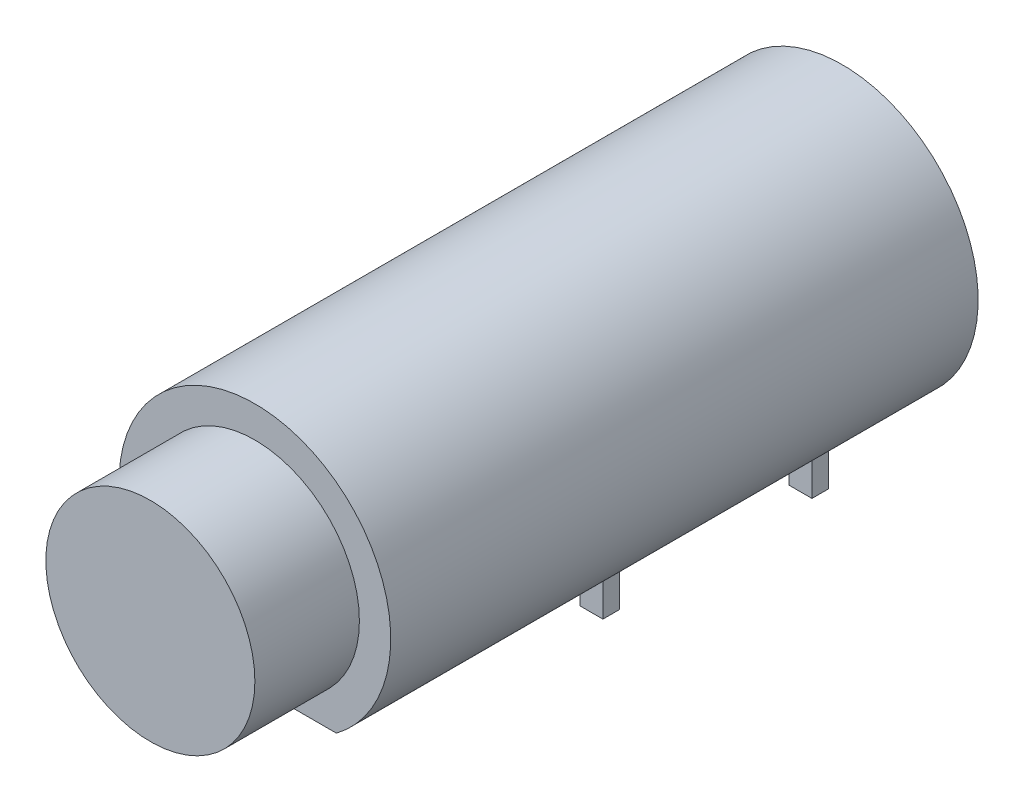
ISO-10303-21;
HEADER;
FILE_DESCRIPTION(('STEP AP214'),'2;1');
FILE_NAME('part.step','',(''),(''),'','','');
FILE_SCHEMA(('AUTOMOTIVE_DESIGN { 1 0 10303 214 1 1 1 1 }'));
ENDSEC;
DATA;
#1=APPLICATION_CONTEXT('core data for automotive mechanical design processes');
#2=APPLICATION_PROTOCOL_DEFINITION('international standard','automotive_design',2000,#1);
#3=PRODUCT_CONTEXT('',#1,'mechanical');
#4=PRODUCT('Part','Part','',(#3));
#5=PRODUCT_RELATED_PRODUCT_CATEGORY('part','',(#4));
#6=PRODUCT_DEFINITION_FORMATION('','',#4);
#7=PRODUCT_DEFINITION_CONTEXT('part definition',#1,'design');
#8=PRODUCT_DEFINITION('design','',#6,#7);
#9=PRODUCT_DEFINITION_SHAPE('','',#8);
#10=(LENGTH_UNIT() NAMED_UNIT(*) SI_UNIT(.MILLI.,.METRE.));
#11=(NAMED_UNIT(*) PLANE_ANGLE_UNIT() SI_UNIT($,.RADIAN.));
#12=(NAMED_UNIT(*) SI_UNIT($,.STERADIAN.) SOLID_ANGLE_UNIT());
#13=UNCERTAINTY_MEASURE_WITH_UNIT(LENGTH_MEASURE(1.E-05),#10,'distance_accuracy_value','');
#14=(GEOMETRIC_REPRESENTATION_CONTEXT(3) GLOBAL_UNCERTAINTY_ASSIGNED_CONTEXT((#13)) GLOBAL_UNIT_ASSIGNED_CONTEXT((#10,
#11,#12)) REPRESENTATION_CONTEXT('',''));
#15=CARTESIAN_POINT('',(0.,0.,0.));
#16=DIRECTION('',(0.,0.,1.));
#17=DIRECTION('',(1.,0.,0.));
#18=AXIS2_PLACEMENT_3D('',#15,#16,#17);
#19=CARTESIAN_POINT('',(-3.9,-5.2,33.1));
#20=DIRECTION('',(0.,1.,0.));
#21=DIRECTION('',(0.,0.,1.));
#22=AXIS2_PLACEMENT_3D('',#19,#20,#21);
#23=PLANE('',#22);
#24=DIRECTION('',(0.,0.,-1.));
#25=VECTOR('',#24,1.);
#26=CARTESIAN_POINT('',(-0.550000000000004,-5.2,12.));
#27=LINE('',#26,#25);
#28=CARTESIAN_POINT('',(-0.550000000000004,-5.2,12.));
#29=VERTEX_POINT('',#28);
#30=CARTESIAN_POINT('',(-0.55,-5.2,11.2));
#31=VERTEX_POINT('',#30);
#32=EDGE_CURVE('E129',#29,#31,#27,.T.);
#33=ORIENTED_EDGE('',*,*,#32,.F.);
#34=DIRECTION('',(-1.,0.,0.));
#35=VECTOR('',#34,1.);
#36=CARTESIAN_POINT('',(-0.550000000000004,-5.2,12.));
#37=LINE('',#36,#35);
#38=CARTESIAN_POINT('',(0.550000000000004,-5.2,12.));
#39=VERTEX_POINT('',#38);
#40=EDGE_CURVE('E142',#39,#29,#37,.T.);
#41=ORIENTED_EDGE('',*,*,#40,.F.);
#42=DIRECTION('',(0.,0.,1.));
#43=VECTOR('',#42,1.);
#44=CARTESIAN_POINT('',(0.550000000000004,-5.2,12.));
#45=LINE('',#44,#43);
#46=CARTESIAN_POINT('',(0.550000000000003,-5.2,11.2));
#47=VERTEX_POINT('',#46);
#48=EDGE_CURVE('E151',#47,#39,#45,.T.);
#49=ORIENTED_EDGE('',*,*,#48,.F.);
#50=DIRECTION('',(1.,0.,0.));
#51=VECTOR('',#50,1.);
#52=CARTESIAN_POINT('',(-0.55,-5.2,11.2));
#53=LINE('',#52,#51);
#54=EDGE_CURVE('E132',#31,#47,#53,.T.);
#55=ORIENTED_EDGE('',*,*,#54,.F.);
#56=EDGE_LOOP('',(#33,#41,#49,#55));
#57=FACE_BOUND('',#56,.T.);
#58=DIRECTION('',(1.,0.,0.));
#59=VECTOR('',#58,1.);
#60=CARTESIAN_POINT('',(-3.9,-5.2,28.1));
#61=LINE('',#60,#59);
#62=CARTESIAN_POINT('',(-3.9,-5.2,28.1));
#63=VERTEX_POINT('',#62);
#64=CARTESIAN_POINT('',(3.9,-5.2,28.1));
#65=VERTEX_POINT('',#64);
#66=EDGE_CURVE('E175',#63,#65,#61,.T.);
#67=ORIENTED_EDGE('',*,*,#66,.F.);
#68=DIRECTION('',(0.,0.,-1.));
#69=VECTOR('',#68,1.);
#70=CARTESIAN_POINT('',(-3.9,-5.2,33.1));
#71=LINE('',#70,#69);
#72=CARTESIAN_POINT('',(-3.9,-5.2,0.));
#73=VERTEX_POINT('',#72);
#74=EDGE_CURVE('E11',#63,#73,#71,.T.);
#75=ORIENTED_EDGE('',*,*,#74,.T.);
#76=DIRECTION('',(1.,0.,0.));
#77=VECTOR('',#76,1.);
#78=CARTESIAN_POINT('',(-3.9,-5.2,0.));
#79=LINE('',#78,#77);
#80=CARTESIAN_POINT('',(3.9,-5.2,0.));
#81=VERTEX_POINT('',#80);
#82=EDGE_CURVE('E180',#73,#81,#79,.T.);
#83=ORIENTED_EDGE('',*,*,#82,.T.);
#84=DIRECTION('',(0.,0.,-1.));
#85=VECTOR('',#84,1.);
#86=CARTESIAN_POINT('',(3.9,-5.2,33.1));
#87=LINE('',#86,#85);
#88=EDGE_CURVE('E40',#65,#81,#87,.T.);
#89=ORIENTED_EDGE('',*,*,#88,.F.);
#90=EDGE_LOOP('',(#67,#75,#83,#89));
#91=FACE_BOUND('',#90,.T.);
#92=DIRECTION('',(0.,0.,-1.));
#93=VECTOR('',#92,1.);
#94=CARTESIAN_POINT('',(-0.549999999999899,-5.2,2.));
#95=LINE('',#94,#93);
#96=CARTESIAN_POINT('',(-0.549999999999899,-5.2,2.));
#97=VERTEX_POINT('',#96);
#98=CARTESIAN_POINT('',(-0.549999999999895,-5.2,1.20000000000001));
#99=VERTEX_POINT('',#98);
#100=EDGE_CURVE('E128',#97,#99,#95,.T.);
#101=ORIENTED_EDGE('',*,*,#100,.F.);
#102=DIRECTION('',(-1.,0.,0.));
#103=VECTOR('',#102,1.);
#104=CARTESIAN_POINT('',(-0.549999999999899,-5.2,2.));
#105=LINE('',#104,#103);
#106=CARTESIAN_POINT('',(0.550000000000109,-5.2,2.));
#107=VERTEX_POINT('',#106);
#108=EDGE_CURVE('E125',#107,#97,#105,.T.);
#109=ORIENTED_EDGE('',*,*,#108,.F.);
#110=DIRECTION('',(0.,0.,1.));
#111=VECTOR('',#110,1.);
#112=CARTESIAN_POINT('',(0.550000000000108,-5.2,2.));
#113=LINE('',#112,#111);
#114=CARTESIAN_POINT('',(0.550000000000108,-5.2,1.20000000000001));
#115=VERTEX_POINT('',#114);
#116=EDGE_CURVE('E52',#115,#107,#113,.T.);
#117=ORIENTED_EDGE('',*,*,#116,.F.);
#118=DIRECTION('',(1.,0.,0.));
#119=VECTOR('',#118,1.);
#120=CARTESIAN_POINT('',(-0.549999999999895,-5.2,1.2));
#121=LINE('',#120,#119);
#122=EDGE_CURVE('E47',#99,#115,#121,.T.);
#123=ORIENTED_EDGE('',*,*,#122,.F.);
#124=EDGE_LOOP('',(#101,#109,#117,#123));
#125=FACE_BOUND('',#124,.T.);
#126=ADVANCED_FACE('F32',(#57,#91,#125),#23,.F.);
#127=CARTESIAN_POINT('',(0.,0.,33.1));
#128=DIRECTION('',(0.,0.,-1.));
#129=DIRECTION('',(-1.,0.,0.));
#130=AXIS2_PLACEMENT_3D('',#127,#128,#129);
#131=CYLINDRICAL_SURFACE('',#130,6.5);
#132=CARTESIAN_POINT('',(0.,0.,28.1));
#133=DIRECTION('',(0.,0.,1.));
#134=DIRECTION('',(1.,0.,0.));
#135=AXIS2_PLACEMENT_3D('',#132,#133,#134);
#136=CIRCLE('',#135,6.5);
#137=EDGE_CURVE('E171',#65,#63,#136,.T.);
#138=ORIENTED_EDGE('',*,*,#137,.F.);
#139=ORIENTED_EDGE('',*,*,#88,.T.);
#140=CARTESIAN_POINT('',(0.,0.,0.));
#141=DIRECTION('',(0.,0.,1.));
#142=DIRECTION('',(1.,0.,0.));
#143=AXIS2_PLACEMENT_3D('',#140,#141,#142);
#144=CIRCLE('',#143,6.5);
#145=EDGE_CURVE('E177',#81,#73,#144,.T.);
#146=ORIENTED_EDGE('',*,*,#145,.T.);
#147=ORIENTED_EDGE('',*,*,#74,.F.);
#148=EDGE_LOOP('',(#138,#139,#146,#147));
#149=FACE_BOUND('',#148,.T.);
#150=ADVANCED_FACE('F34',(#149),#131,.T.);
#151=CARTESIAN_POINT('',(0.,0.,0.));
#152=DIRECTION('',(0.,0.,1.));
#153=DIRECTION('',(1.,0.,0.));
#154=AXIS2_PLACEMENT_3D('',#151,#152,#153);
#155=PLANE('',#154);
#156=ORIENTED_EDGE('',*,*,#145,.F.);
#157=ORIENTED_EDGE('',*,*,#82,.F.);
#158=EDGE_LOOP('',(#156,#157));
#159=FACE_BOUND('',#158,.T.);
#160=ADVANCED_FACE('F191',(#159),#155,.F.);
#161=CARTESIAN_POINT('',(0.,0.,28.1));
#162=DIRECTION('',(0.,0.,1.));
#163=DIRECTION('',(1.,0.,0.));
#164=AXIS2_PLACEMENT_3D('',#161,#162,#163);
#165=PLANE('',#164);
#166=CARTESIAN_POINT('',(0.,0.,28.1));
#167=DIRECTION('',(0.,0.,1.));
#168=DIRECTION('',(1.,0.,0.));
#169=AXIS2_PLACEMENT_3D('',#166,#167,#168);
#170=CIRCLE('',#169,5.);
#171=CARTESIAN_POINT('',(5.,0.,28.1));
#172=VERTEX_POINT('',#171);
#173=EDGE_CURVE('E168',#172,#172,#170,.T.);
#174=ORIENTED_EDGE('',*,*,#173,.F.);
#175=EDGE_LOOP('',(#174));
#176=FACE_BOUND('',#175,.T.);
#177=ORIENTED_EDGE('',*,*,#137,.T.);
#178=ORIENTED_EDGE('',*,*,#66,.T.);
#179=EDGE_LOOP('',(#177,#178));
#180=FACE_BOUND('',#179,.T.);
#181=ADVANCED_FACE('F193',(#176,#180),#165,.T.);
#182=CARTESIAN_POINT('',(0.,0.,28.1));
#183=DIRECTION('',(0.,0.,1.));
#184=DIRECTION('',(1.,0.,0.));
#185=AXIS2_PLACEMENT_3D('',#182,#183,#184);
#186=CYLINDRICAL_SURFACE('',#185,5.);
#187=ORIENTED_EDGE('',*,*,#173,.T.);
#188=EDGE_LOOP('',(#187));
#189=FACE_BOUND('',#188,.T.);
#190=CARTESIAN_POINT('',(0.,0.,33.1));
#191=DIRECTION('',(0.,0.,1.));
#192=DIRECTION('',(1.,0.,0.));
#193=AXIS2_PLACEMENT_3D('',#190,#191,#192);
#194=CIRCLE('',#193,5.);
#195=CARTESIAN_POINT('',(5.,0.,33.1));
#196=VERTEX_POINT('',#195);
#197=EDGE_CURVE('E167',#196,#196,#194,.T.);
#198=ORIENTED_EDGE('',*,*,#197,.F.);
#199=EDGE_LOOP('',(#198));
#200=FACE_BOUND('',#199,.T.);
#201=ADVANCED_FACE('F199',(#189,#200),#186,.T.);
#202=CARTESIAN_POINT('',(0.,0.,33.1));
#203=DIRECTION('',(0.,0.,1.));
#204=DIRECTION('',(1.,0.,0.));
#205=AXIS2_PLACEMENT_3D('',#202,#203,#204);
#206=PLANE('',#205);
#207=ORIENTED_EDGE('',*,*,#197,.T.);
#208=EDGE_LOOP('',(#207));
#209=FACE_BOUND('',#208,.T.);
#210=ADVANCED_FACE('F231',(#209),#206,.T.);
#211=CARTESIAN_POINT('',(-0.550000000000004,-10.2,12.));
#212=DIRECTION('',(1.,0.,0.));
#213=DIRECTION('',(0.,0.,-1.));
#214=AXIS2_PLACEMENT_3D('',#211,#212,#213);
#215=PLANE('',#214);
#216=ORIENTED_EDGE('',*,*,#32,.T.);
#217=DIRECTION('',(0.,1.,0.));
#218=VECTOR('',#217,1.);
#219=CARTESIAN_POINT('',(-0.55,-10.2,11.2));
#220=LINE('',#219,#218);
#221=CARTESIAN_POINT('',(-0.55,-10.2,11.2));
#222=VERTEX_POINT('',#221);
#223=EDGE_CURVE('E164',#222,#31,#220,.T.);
#224=ORIENTED_EDGE('',*,*,#223,.F.);
#225=DIRECTION('',(0.,0.,-1.));
#226=VECTOR('',#225,1.);
#227=CARTESIAN_POINT('',(-0.550000000000004,-10.2,12.));
#228=LINE('',#227,#226);
#229=CARTESIAN_POINT('',(-0.550000000000004,-10.2,12.));
#230=VERTEX_POINT('',#229);
#231=EDGE_CURVE('E138',#230,#222,#228,.T.);
#232=ORIENTED_EDGE('',*,*,#231,.F.);
#233=DIRECTION('',(0.,1.,0.));
#234=VECTOR('',#233,1.);
#235=CARTESIAN_POINT('',(-0.550000000000004,-10.2,12.));
#236=LINE('',#235,#234);
#237=EDGE_CURVE('E147',#230,#29,#236,.T.);
#238=ORIENTED_EDGE('',*,*,#237,.T.);
#239=EDGE_LOOP('',(#216,#224,#232,#238));
#240=FACE_BOUND('',#239,.T.);
#241=ADVANCED_FACE('F215',(#240),#215,.F.);
#242=CARTESIAN_POINT('',(-0.55,-10.2,11.2));
#243=DIRECTION('',(0.,0.,1.));
#244=DIRECTION('',(1.,0.,0.));
#245=AXIS2_PLACEMENT_3D('',#242,#243,#244);
#246=PLANE('',#245);
#247=ORIENTED_EDGE('',*,*,#54,.T.);
#248=DIRECTION('',(0.,1.,0.));
#249=VECTOR('',#248,1.);
#250=CARTESIAN_POINT('',(0.550000000000004,-10.2,11.2));
#251=LINE('',#250,#249);
#252=CARTESIAN_POINT('',(0.550000000000004,-10.2,11.2));
#253=VERTEX_POINT('',#252);
#254=EDGE_CURVE('E161',#253,#47,#251,.T.);
#255=ORIENTED_EDGE('',*,*,#254,.F.);
#256=DIRECTION('',(1.,0.,0.));
#257=VECTOR('',#256,1.);
#258=CARTESIAN_POINT('',(-0.55,-10.2,11.2));
#259=LINE('',#258,#257);
#260=EDGE_CURVE('E141',#222,#253,#259,.T.);
#261=ORIENTED_EDGE('',*,*,#260,.F.);
#262=ORIENTED_EDGE('',*,*,#223,.T.);
#263=EDGE_LOOP('',(#247,#255,#261,#262));
#264=FACE_BOUND('',#263,.T.);
#265=ADVANCED_FACE('F223',(#264),#246,.F.);
#266=CARTESIAN_POINT('',(0.550000000000004,-10.2,12.));
#267=DIRECTION('',(-1.,0.,0.));
#268=DIRECTION('',(0.,0.,1.));
#269=AXIS2_PLACEMENT_3D('',#266,#267,#268);
#270=PLANE('',#269);
#271=ORIENTED_EDGE('',*,*,#48,.T.);
#272=DIRECTION('',(0.,1.,0.));
#273=VECTOR('',#272,1.);
#274=CARTESIAN_POINT('',(0.550000000000004,-10.2,12.));
#275=LINE('',#274,#273);
#276=CARTESIAN_POINT('',(0.550000000000004,-10.2,12.));
#277=VERTEX_POINT('',#276);
#278=EDGE_CURVE('E158',#277,#39,#275,.T.);
#279=ORIENTED_EDGE('',*,*,#278,.F.);
#280=DIRECTION('',(0.,0.,1.));
#281=VECTOR('',#280,1.);
#282=CARTESIAN_POINT('',(0.550000000000004,-10.2,12.));
#283=LINE('',#282,#281);
#284=EDGE_CURVE('E144',#253,#277,#283,.T.);
#285=ORIENTED_EDGE('',*,*,#284,.F.);
#286=ORIENTED_EDGE('',*,*,#254,.T.);
#287=EDGE_LOOP('',(#271,#279,#285,#286));
#288=FACE_BOUND('',#287,.T.);
#289=ADVANCED_FACE('F221',(#288),#270,.F.);
#290=CARTESIAN_POINT('',(-0.550000000000004,-10.2,12.));
#291=DIRECTION('',(0.,0.,-1.));
#292=DIRECTION('',(-1.,0.,0.));
#293=AXIS2_PLACEMENT_3D('',#290,#291,#292);
#294=PLANE('',#293);
#295=ORIENTED_EDGE('',*,*,#40,.T.);
#296=ORIENTED_EDGE('',*,*,#237,.F.);
#297=DIRECTION('',(-1.,0.,0.));
#298=VECTOR('',#297,1.);
#299=CARTESIAN_POINT('',(-0.550000000000004,-10.2,12.));
#300=LINE('',#299,#298);
#301=EDGE_CURVE('E146',#277,#230,#300,.T.);
#302=ORIENTED_EDGE('',*,*,#301,.F.);
#303=ORIENTED_EDGE('',*,*,#278,.T.);
#304=EDGE_LOOP('',(#295,#296,#302,#303));
#305=FACE_BOUND('',#304,.T.);
#306=ADVANCED_FACE('F211',(#305),#294,.F.);
#307=CARTESIAN_POINT('',(0.,-10.2,0.));
#308=DIRECTION('',(0.,-1.,0.));
#309=DIRECTION('',(0.,0.,-1.));
#310=AXIS2_PLACEMENT_3D('',#307,#308,#309);
#311=PLANE('',#310);
#312=ORIENTED_EDGE('',*,*,#231,.T.);
#313=ORIENTED_EDGE('',*,*,#260,.T.);
#314=ORIENTED_EDGE('',*,*,#284,.T.);
#315=ORIENTED_EDGE('',*,*,#301,.T.);
#316=EDGE_LOOP('',(#312,#313,#314,#315));
#317=FACE_BOUND('',#316,.T.);
#318=ADVANCED_FACE('F217',(#317),#311,.T.);
#319=CARTESIAN_POINT('',(-0.549999999999899,-10.2,2.));
#320=DIRECTION('',(1.,0.,0.));
#321=DIRECTION('',(0.,0.,-1.));
#322=AXIS2_PLACEMENT_3D('',#319,#320,#321);
#323=PLANE('',#322);
#324=ORIENTED_EDGE('',*,*,#100,.T.);
#325=DIRECTION('',(0.,1.,0.));
#326=VECTOR('',#325,1.);
#327=CARTESIAN_POINT('',(-0.549999999999895,-10.2,1.2));
#328=LINE('',#327,#326);
#329=CARTESIAN_POINT('',(-0.549999999999895,-10.2,1.2));
#330=VERTEX_POINT('',#329);
#331=EDGE_CURVE('E109',#330,#99,#328,.T.);
#332=ORIENTED_EDGE('',*,*,#331,.F.);
#333=DIRECTION('',(0.,0.,-1.));
#334=VECTOR('',#333,1.);
#335=CARTESIAN_POINT('',(-0.549999999999899,-10.2,2.));
#336=LINE('',#335,#334);
#337=CARTESIAN_POINT('',(-0.549999999999899,-10.2,2.));
#338=VERTEX_POINT('',#337);
#339=EDGE_CURVE('E116',#338,#330,#336,.T.);
#340=ORIENTED_EDGE('',*,*,#339,.F.);
#341=DIRECTION('',(0.,1.,0.));
#342=VECTOR('',#341,1.);
#343=CARTESIAN_POINT('',(-0.549999999999899,-10.2,2.));
#344=LINE('',#343,#342);
#345=EDGE_CURVE('E326',#338,#97,#344,.T.);
#346=ORIENTED_EDGE('',*,*,#345,.T.);
#347=EDGE_LOOP('',(#324,#332,#340,#346));
#348=FACE_BOUND('',#347,.T.);
#349=ADVANCED_FACE('F127',(#348),#323,.F.);
#350=CARTESIAN_POINT('',(-0.549999999999895,-10.2,1.2));
#351=DIRECTION('',(0.,0.,1.));
#352=DIRECTION('',(1.,0.,0.));
#353=AXIS2_PLACEMENT_3D('',#350,#351,#352);
#354=PLANE('',#353);
#355=ORIENTED_EDGE('',*,*,#122,.T.);
#356=DIRECTION('',(0.,1.,0.));
#357=VECTOR('',#356,1.);
#358=CARTESIAN_POINT('',(0.550000000000108,-10.2,1.2));
#359=LINE('',#358,#357);
#360=CARTESIAN_POINT('',(0.550000000000108,-10.2,1.2));
#361=VERTEX_POINT('',#360);
#362=EDGE_CURVE('E112',#361,#115,#359,.T.);
#363=ORIENTED_EDGE('',*,*,#362,.F.);
#364=DIRECTION('',(1.,0.,0.));
#365=VECTOR('',#364,1.);
#366=CARTESIAN_POINT('',(-0.549999999999895,-10.2,1.2));
#367=LINE('',#366,#365);
#368=EDGE_CURVE('E105',#330,#361,#367,.T.);
#369=ORIENTED_EDGE('',*,*,#368,.F.);
#370=ORIENTED_EDGE('',*,*,#331,.T.);
#371=EDGE_LOOP('',(#355,#363,#369,#370));
#372=FACE_BOUND('',#371,.T.);
#373=ADVANCED_FACE('F107',(#372),#354,.F.);
#374=CARTESIAN_POINT('',(0.550000000000108,-10.2,2.));
#375=DIRECTION('',(-1.,0.,0.));
#376=DIRECTION('',(0.,0.,1.));
#377=AXIS2_PLACEMENT_3D('',#374,#375,#376);
#378=PLANE('',#377);
#379=ORIENTED_EDGE('',*,*,#116,.T.);
#380=DIRECTION('',(0.,1.,0.));
#381=VECTOR('',#380,1.);
#382=CARTESIAN_POINT('',(0.550000000000108,-10.2,2.));
#383=LINE('',#382,#381);
#384=CARTESIAN_POINT('',(0.550000000000108,-10.2,2.));
#385=VERTEX_POINT('',#384);
#386=EDGE_CURVE('E134',#385,#107,#383,.T.);
#387=ORIENTED_EDGE('',*,*,#386,.F.);
#388=DIRECTION('',(0.,0.,1.));
#389=VECTOR('',#388,1.);
#390=CARTESIAN_POINT('',(0.550000000000108,-10.2,2.));
#391=LINE('',#390,#389);
#392=EDGE_CURVE('E115',#361,#385,#391,.T.);
#393=ORIENTED_EDGE('',*,*,#392,.F.);
#394=ORIENTED_EDGE('',*,*,#362,.T.);
#395=EDGE_LOOP('',(#379,#387,#393,#394));
#396=FACE_BOUND('',#395,.T.);
#397=ADVANCED_FACE('F293',(#396),#378,.F.);
#398=CARTESIAN_POINT('',(-0.549999999999899,-10.2,2.));
#399=DIRECTION('',(0.,0.,-1.));
#400=DIRECTION('',(-1.,0.,0.));
#401=AXIS2_PLACEMENT_3D('',#398,#399,#400);
#402=PLANE('',#401);
#403=ORIENTED_EDGE('',*,*,#108,.T.);
#404=ORIENTED_EDGE('',*,*,#345,.F.);
#405=DIRECTION('',(-1.,0.,0.));
#406=VECTOR('',#405,1.);
#407=CARTESIAN_POINT('',(-0.549999999999899,-10.2,2.));
#408=LINE('',#407,#406);
#409=EDGE_CURVE('E121',#385,#338,#408,.T.);
#410=ORIENTED_EDGE('',*,*,#409,.F.);
#411=ORIENTED_EDGE('',*,*,#386,.T.);
#412=EDGE_LOOP('',(#403,#404,#410,#411));
#413=FACE_BOUND('',#412,.T.);
#414=ADVANCED_FACE('F302',(#413),#402,.F.);
#415=CARTESIAN_POINT('',(0.,-10.2,0.));
#416=DIRECTION('',(0.,-1.,0.));
#417=DIRECTION('',(0.,0.,-1.));
#418=AXIS2_PLACEMENT_3D('',#415,#416,#417);
#419=PLANE('',#418);
#420=ORIENTED_EDGE('',*,*,#339,.T.);
#421=ORIENTED_EDGE('',*,*,#368,.T.);
#422=ORIENTED_EDGE('',*,*,#392,.T.);
#423=ORIENTED_EDGE('',*,*,#409,.T.);
#424=EDGE_LOOP('',(#420,#421,#422,#423));
#425=FACE_BOUND('',#424,.T.);
#426=ADVANCED_FACE('F119',(#425),#419,.T.);
#427=CLOSED_SHELL('',(#126,#150,#160,#181,#201,#210,#241,#265,#289,#306,#318,#349,#373,#397,
#414,#426));
#428=MANIFOLD_SOLID_BREP('B2',#427);
#429=ADVANCED_BREP_SHAPE_REPRESENTATION('',(#18,#428),#14);
#430=SHAPE_DEFINITION_REPRESENTATION(#9,#429);
ENDSEC;
END-ISO-10303-21;
